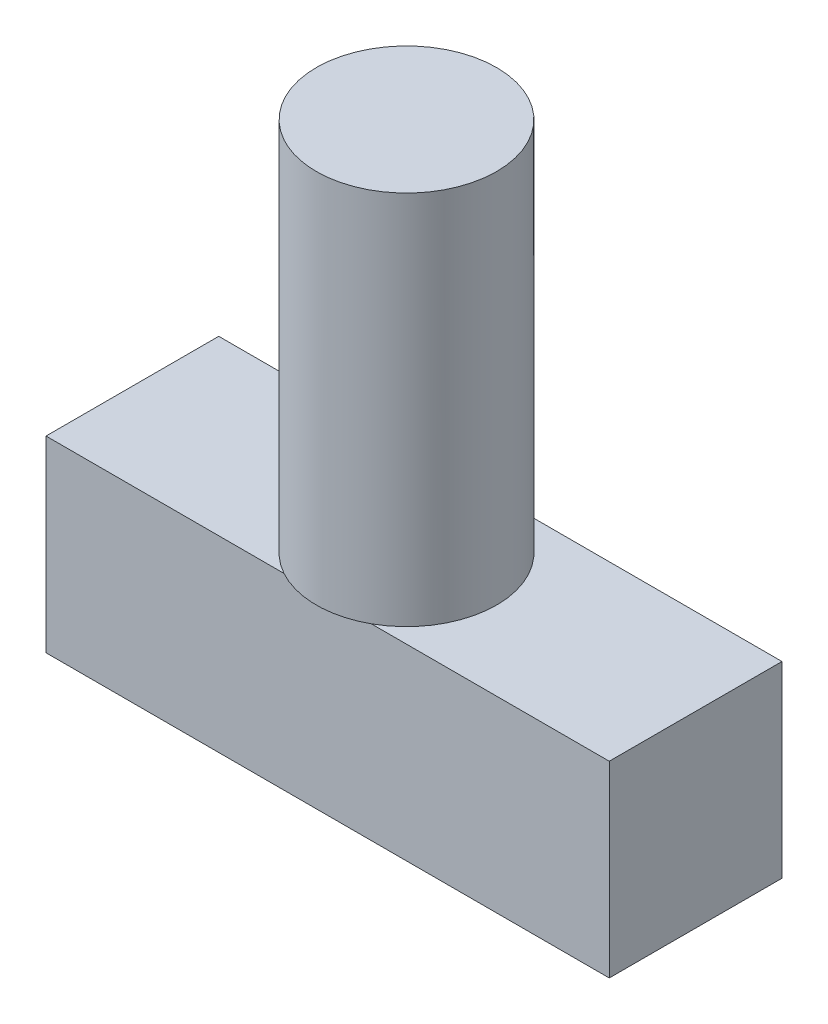
ISO-10303-21;
HEADER;
FILE_DESCRIPTION(('STEP AP214'),'2;1');
FILE_NAME('part.step','',(''),(''),'','','');
FILE_SCHEMA(('AUTOMOTIVE_DESIGN { 1 0 10303 214 1 1 1 1 }'));
ENDSEC;
DATA;
#1=APPLICATION_CONTEXT('core data for automotive mechanical design processes');
#2=APPLICATION_PROTOCOL_DEFINITION('international standard','automotive_design',2000,#1);
#3=PRODUCT_CONTEXT('',#1,'mechanical');
#4=PRODUCT('Part','Part','',(#3));
#5=PRODUCT_RELATED_PRODUCT_CATEGORY('part','',(#4));
#6=PRODUCT_DEFINITION_FORMATION('','',#4);
#7=PRODUCT_DEFINITION_CONTEXT('part definition',#1,'design');
#8=PRODUCT_DEFINITION('design','',#6,#7);
#9=PRODUCT_DEFINITION_SHAPE('','',#8);
#10=(LENGTH_UNIT() NAMED_UNIT(*) SI_UNIT(.MILLI.,.METRE.));
#11=(NAMED_UNIT(*) PLANE_ANGLE_UNIT() SI_UNIT($,.RADIAN.));
#12=(NAMED_UNIT(*) SI_UNIT($,.STERADIAN.) SOLID_ANGLE_UNIT());
#13=UNCERTAINTY_MEASURE_WITH_UNIT(LENGTH_MEASURE(1.E-05),#10,'distance_accuracy_value','');
#14=(GEOMETRIC_REPRESENTATION_CONTEXT(3) GLOBAL_UNCERTAINTY_ASSIGNED_CONTEXT((#13)) GLOBAL_UNIT_ASSIGNED_CONTEXT((#10,
#11,#12)) REPRESENTATION_CONTEXT('',''));
#15=CARTESIAN_POINT('',(0.,0.,0.));
#16=DIRECTION('',(0.,0.,1.));
#17=DIRECTION('',(1.,0.,0.));
#18=AXIS2_PLACEMENT_3D('',#15,#16,#17);
#19=CARTESIAN_POINT('',(7.5,5.,2.1));
#20=DIRECTION('',(-1.,0.,0.));
#21=DIRECTION('',(0.,0.,1.));
#22=AXIS2_PLACEMENT_3D('',#19,#20,#21);
#23=PLANE('',#22);
#24=DIRECTION('',(0.,0.,-1.));
#25=VECTOR('',#24,1.);
#26=CARTESIAN_POINT('',(7.5,0.,2.1));
#27=LINE('',#26,#25);
#28=CARTESIAN_POINT('',(7.5,0.,2.1));
#29=VERTEX_POINT('',#28);
#30=CARTESIAN_POINT('',(7.5,0.,-2.5));
#31=VERTEX_POINT('',#30);
#32=EDGE_CURVE('E117',#29,#31,#27,.T.);
#33=ORIENTED_EDGE('',*,*,#32,.T.);
#34=DIRECTION('',(0.,-1.,0.));
#35=VECTOR('',#34,1.);
#36=CARTESIAN_POINT('',(7.5,5.,-2.5));
#37=LINE('',#36,#35);
#38=CARTESIAN_POINT('',(7.5,5.,-2.5));
#39=VERTEX_POINT('',#38);
#40=EDGE_CURVE('E11',#39,#31,#37,.T.);
#41=ORIENTED_EDGE('',*,*,#40,.F.);
#42=DIRECTION('',(0.,0.,-1.));
#43=VECTOR('',#42,1.);
#44=CARTESIAN_POINT('',(7.5,5.,2.1));
#45=LINE('',#44,#43);
#46=CARTESIAN_POINT('',(7.5,5.,2.1));
#47=VERTEX_POINT('',#46);
#48=EDGE_CURVE('E120',#47,#39,#45,.T.);
#49=ORIENTED_EDGE('',*,*,#48,.F.);
#50=DIRECTION('',(0.,-1.,0.));
#51=VECTOR('',#50,1.);
#52=CARTESIAN_POINT('',(7.5,5.,2.1));
#53=LINE('',#52,#51);
#54=EDGE_CURVE('E98',#47,#29,#53,.T.);
#55=ORIENTED_EDGE('',*,*,#54,.T.);
#56=EDGE_LOOP('',(#33,#41,#49,#55));
#57=FACE_BOUND('',#56,.T.);
#58=ADVANCED_FACE('F39',(#57),#23,.F.);
#59=CARTESIAN_POINT('',(-7.5,5.,-2.5));
#60=DIRECTION('',(0.,0.,1.));
#61=DIRECTION('',(1.,0.,0.));
#62=AXIS2_PLACEMENT_3D('',#59,#60,#61);
#63=PLANE('',#62);
#64=DIRECTION('',(-1.,0.,0.));
#65=VECTOR('',#64,1.);
#66=CARTESIAN_POINT('',(-7.5,0.,-2.5));
#67=LINE('',#66,#65);
#68=CARTESIAN_POINT('',(-7.5,0.,-2.5));
#69=VERTEX_POINT('',#68);
#70=EDGE_CURVE('E130',#31,#69,#67,.T.);
#71=ORIENTED_EDGE('',*,*,#70,.T.);
#72=DIRECTION('',(0.,-1.,0.));
#73=VECTOR('',#72,1.);
#74=CARTESIAN_POINT('',(-7.5,5.,-2.5));
#75=LINE('',#74,#73);
#76=CARTESIAN_POINT('',(-7.5,5.,-2.5));
#77=VERTEX_POINT('',#76);
#78=EDGE_CURVE('E47',#77,#69,#75,.T.);
#79=ORIENTED_EDGE('',*,*,#78,.F.);
#80=DIRECTION('',(-1.,0.,0.));
#81=VECTOR('',#80,1.);
#82=CARTESIAN_POINT('',(-7.5,5.,-2.5));
#83=LINE('',#82,#81);
#84=EDGE_CURVE('E88',#39,#77,#83,.T.);
#85=ORIENTED_EDGE('',*,*,#84,.F.);
#86=ORIENTED_EDGE('',*,*,#40,.T.);
#87=EDGE_LOOP('',(#71,#79,#85,#86));
#88=FACE_BOUND('',#87,.T.);
#89=ADVANCED_FACE('F153',(#88),#63,.F.);
#90=CARTESIAN_POINT('',(-7.5,5.,2.1));
#91=DIRECTION('',(1.,0.,0.));
#92=DIRECTION('',(0.,0.,-1.));
#93=AXIS2_PLACEMENT_3D('',#90,#91,#92);
#94=PLANE('',#93);
#95=DIRECTION('',(0.,0.,1.));
#96=VECTOR('',#95,1.);
#97=CARTESIAN_POINT('',(-7.5,0.,2.1));
#98=LINE('',#97,#96);
#99=CARTESIAN_POINT('',(-7.5,0.,2.1));
#100=VERTEX_POINT('',#99);
#101=EDGE_CURVE('E133',#69,#100,#98,.T.);
#102=ORIENTED_EDGE('',*,*,#101,.T.);
#103=DIRECTION('',(0.,-1.,0.));
#104=VECTOR('',#103,1.);
#105=CARTESIAN_POINT('',(-7.5,5.,2.1));
#106=LINE('',#105,#104);
#107=CARTESIAN_POINT('',(-7.5,5.,2.1));
#108=VERTEX_POINT('',#107);
#109=EDGE_CURVE('E140',#108,#100,#106,.T.);
#110=ORIENTED_EDGE('',*,*,#109,.F.);
#111=DIRECTION('',(0.,0.,1.));
#112=VECTOR('',#111,1.);
#113=CARTESIAN_POINT('',(-7.5,5.,2.1));
#114=LINE('',#113,#112);
#115=EDGE_CURVE('E95',#77,#108,#114,.T.);
#116=ORIENTED_EDGE('',*,*,#115,.F.);
#117=ORIENTED_EDGE('',*,*,#78,.T.);
#118=EDGE_LOOP('',(#102,#110,#116,#117));
#119=FACE_BOUND('',#118,.T.);
#120=ADVANCED_FACE('F146',(#119),#94,.F.);
#121=CARTESIAN_POINT('',(-7.5,5.,2.1));
#122=DIRECTION('',(0.,0.,-1.));
#123=DIRECTION('',(-1.,0.,0.));
#124=AXIS2_PLACEMENT_3D('',#121,#122,#123);
#125=PLANE('',#124);
#126=DIRECTION('',(1.,0.,0.));
#127=VECTOR('',#126,1.);
#128=CARTESIAN_POINT('',(-7.5,0.,2.1));
#129=LINE('',#128,#127);
#130=EDGE_CURVE('E81',#100,#29,#129,.T.);
#131=ORIENTED_EDGE('',*,*,#130,.T.);
#132=ORIENTED_EDGE('',*,*,#54,.F.);
#133=DIRECTION('',(1.,0.,0.));
#134=VECTOR('',#133,1.);
#135=CARTESIAN_POINT('',(-7.5,5.,2.1));
#136=LINE('',#135,#134);
#137=CARTESIAN_POINT('',(1.16189500386223,5.,2.1));
#138=VERTEX_POINT('',#137);
#139=EDGE_CURVE('E59',#138,#47,#136,.T.);
#140=ORIENTED_EDGE('',*,*,#139,.F.);
#141=CARTESIAN_POINT('',(-1.16189500386223,5.,2.1));
#142=VERTEX_POINT('',#141);
#143=EDGE_CURVE('E99',#142,#138,#136,.T.);
#144=ORIENTED_EDGE('',*,*,#143,.F.);
#145=EDGE_CURVE('E91',#108,#142,#136,.T.);
#146=ORIENTED_EDGE('',*,*,#145,.F.);
#147=ORIENTED_EDGE('',*,*,#109,.T.);
#148=EDGE_LOOP('',(#131,#132,#140,#144,#146,#147));
#149=FACE_BOUND('',#148,.T.);
#150=ADVANCED_FACE('F103',(#149),#125,.F.);
#151=CARTESIAN_POINT('',(0.,5.,0.));
#152=DIRECTION('',(0.,-1.,0.));
#153=DIRECTION('',(0.,0.,-1.));
#154=AXIS2_PLACEMENT_3D('',#151,#152,#153);
#155=PLANE('',#154);
#156=CARTESIAN_POINT('',(0.,5.,0.));
#157=DIRECTION('',(0.,1.,0.));
#158=DIRECTION('',(0.,0.,1.));
#159=AXIS2_PLACEMENT_3D('',#156,#157,#158);
#160=CIRCLE('',#159,2.4);
#161=EDGE_CURVE('E54',#138,#142,#160,.T.);
#162=ORIENTED_EDGE('',*,*,#161,.F.);
#163=ORIENTED_EDGE('',*,*,#139,.T.);
#164=ORIENTED_EDGE('',*,*,#48,.T.);
#165=ORIENTED_EDGE('',*,*,#84,.T.);
#166=ORIENTED_EDGE('',*,*,#115,.T.);
#167=ORIENTED_EDGE('',*,*,#145,.T.);
#168=EDGE_LOOP('',(#162,#163,#164,#165,#166,#167));
#169=FACE_BOUND('',#168,.T.);
#170=ADVANCED_FACE('F93',(#169),#155,.F.);
#171=CARTESIAN_POINT('',(0.,0.,0.));
#172=DIRECTION('',(0.,-1.,0.));
#173=DIRECTION('',(0.,0.,-1.));
#174=AXIS2_PLACEMENT_3D('',#171,#172,#173);
#175=PLANE('',#174);
#176=ORIENTED_EDGE('',*,*,#32,.F.);
#177=ORIENTED_EDGE('',*,*,#130,.F.);
#178=ORIENTED_EDGE('',*,*,#101,.F.);
#179=ORIENTED_EDGE('',*,*,#70,.F.);
#180=EDGE_LOOP('',(#176,#177,#178,#179));
#181=FACE_BOUND('',#180,.T.);
#182=ADVANCED_FACE('F149',(#181),#175,.T.);
#183=CARTESIAN_POINT('',(0.,5.,0.));
#184=DIRECTION('',(0.,1.,0.));
#185=DIRECTION('',(0.,0.,1.));
#186=AXIS2_PLACEMENT_3D('',#183,#184,#185);
#187=PLANE('',#186);
#188=EDGE_CURVE('E107',#142,#138,#160,.T.);
#189=ORIENTED_EDGE('',*,*,#188,.F.);
#190=ORIENTED_EDGE('',*,*,#143,.T.);
#191=EDGE_LOOP('',(#189,#190));
#192=FACE_BOUND('',#191,.T.);
#193=ADVANCED_FACE('F108',(#192),#187,.F.);
#194=CARTESIAN_POINT('',(0.,15.,0.));
#195=DIRECTION('',(0.,-1.,0.));
#196=DIRECTION('',(0.,0.,-1.));
#197=AXIS2_PLACEMENT_3D('',#194,#195,#196);
#198=CYLINDRICAL_SURFACE('',#197,2.4);
#199=CARTESIAN_POINT('',(0.,15.,0.));
#200=DIRECTION('',(0.,1.,0.));
#201=DIRECTION('',(0.,0.,1.));
#202=AXIS2_PLACEMENT_3D('',#199,#200,#201);
#203=CIRCLE('',#202,2.4);
#204=CARTESIAN_POINT('',(0.,15.,2.4));
#205=VERTEX_POINT('',#204);
#206=EDGE_CURVE('E114',#205,#205,#203,.T.);
#207=ORIENTED_EDGE('',*,*,#206,.F.);
#208=EDGE_LOOP('',(#207));
#209=FACE_BOUND('',#208,.T.);
#210=ORIENTED_EDGE('',*,*,#161,.T.);
#211=ORIENTED_EDGE('',*,*,#188,.T.);
#212=EDGE_LOOP('',(#210,#211));
#213=FACE_BOUND('',#212,.T.);
#214=ADVANCED_FACE('F112',(#209,#213),#198,.T.);
#215=CARTESIAN_POINT('',(0.,15.,0.));
#216=DIRECTION('',(0.,1.,0.));
#217=DIRECTION('',(0.,0.,1.));
#218=AXIS2_PLACEMENT_3D('',#215,#216,#217);
#219=PLANE('',#218);
#220=ORIENTED_EDGE('',*,*,#206,.T.);
#221=EDGE_LOOP('',(#220));
#222=FACE_BOUND('',#221,.T.);
#223=ADVANCED_FACE('F169',(#222),#219,.T.);
#224=CLOSED_SHELL('',(#58,#89,#120,#150,#170,#182,#193,#214,#223));
#225=MANIFOLD_SOLID_BREP('B2',#224);
#226=ADVANCED_BREP_SHAPE_REPRESENTATION('',(#18,#225),#14);
#227=SHAPE_DEFINITION_REPRESENTATION(#9,#226);
ENDSEC;
END-ISO-10303-21;
